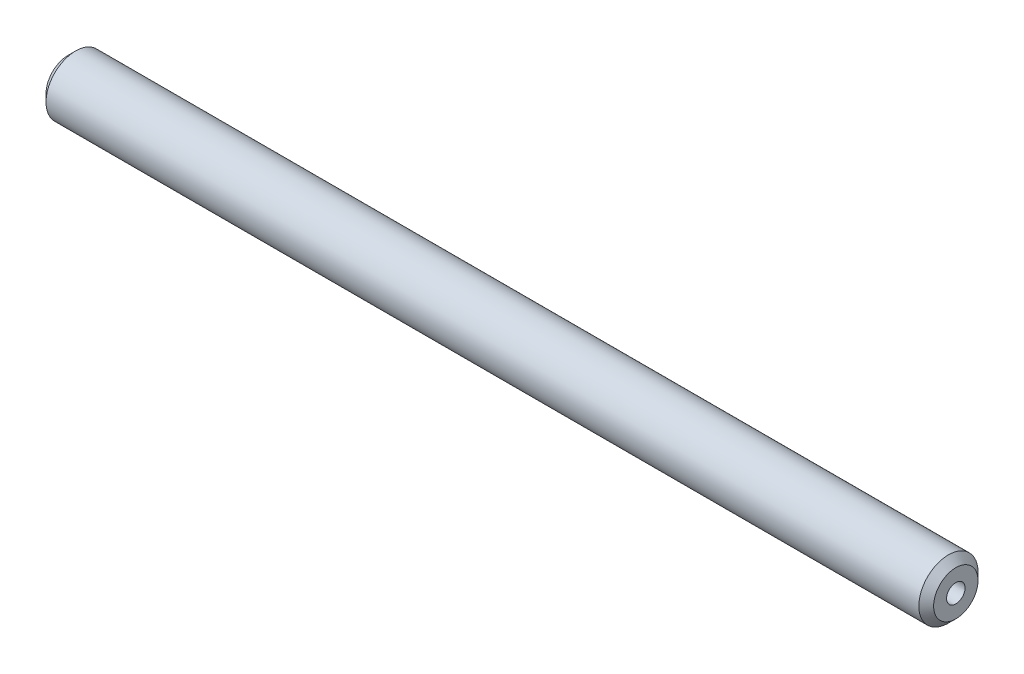
ISO-10303-21;
HEADER;
FILE_DESCRIPTION(('STEP AP214'),'2;1');
FILE_NAME('part.step','',(''),(''),'','','');
FILE_SCHEMA(('AUTOMOTIVE_DESIGN { 1 0 10303 214 1 1 1 1 }'));
ENDSEC;
DATA;
#1=APPLICATION_CONTEXT('core data for automotive mechanical design processes');
#2=APPLICATION_PROTOCOL_DEFINITION('international standard','automotive_design',2000,#1);
#3=PRODUCT_CONTEXT('',#1,'mechanical');
#4=PRODUCT('Part','Part','',(#3));
#5=PRODUCT_RELATED_PRODUCT_CATEGORY('part','',(#4));
#6=PRODUCT_DEFINITION_FORMATION('','',#4);
#7=PRODUCT_DEFINITION_CONTEXT('part definition',#1,'design');
#8=PRODUCT_DEFINITION('design','',#6,#7);
#9=PRODUCT_DEFINITION_SHAPE('','',#8);
#10=(LENGTH_UNIT() NAMED_UNIT(*) SI_UNIT(.MILLI.,.METRE.));
#11=(NAMED_UNIT(*) PLANE_ANGLE_UNIT() SI_UNIT($,.RADIAN.));
#12=(NAMED_UNIT(*) SI_UNIT($,.STERADIAN.) SOLID_ANGLE_UNIT());
#13=UNCERTAINTY_MEASURE_WITH_UNIT(LENGTH_MEASURE(1.E-05),#10,'distance_accuracy_value','');
#14=(GEOMETRIC_REPRESENTATION_CONTEXT(3) GLOBAL_UNCERTAINTY_ASSIGNED_CONTEXT((#13)) GLOBAL_UNIT_ASSIGNED_CONTEXT((#10,
#11,#12)) REPRESENTATION_CONTEXT('',''));
#15=CARTESIAN_POINT('',(0.,0.,0.));
#16=DIRECTION('',(0.,0.,1.));
#17=DIRECTION('',(1.,0.,0.));
#18=AXIS2_PLACEMENT_3D('',#15,#16,#17);
#19=CARTESIAN_POINT('',(60.,0.,0.));
#20=DIRECTION('',(-1.,0.,0.));
#21=DIRECTION('',(0.,0.,1.));
#22=AXIS2_PLACEMENT_3D('',#19,#20,#21);
#23=CYLINDRICAL_SURFACE('',#22,4.);
#24=CARTESIAN_POINT('',(59.,0.,0.));
#25=DIRECTION('',(1.,0.,0.));
#26=DIRECTION('',(0.,0.,-1.));
#27=AXIS2_PLACEMENT_3D('',#24,#25,#26);
#28=CIRCLE('',#27,4.);
#29=CARTESIAN_POINT('',(59.,0.,-4.));
#30=VERTEX_POINT('',#29);
#31=EDGE_CURVE('E50',#30,#30,#28,.F.);
#32=ORIENTED_EDGE('',*,*,#31,.T.);
#33=EDGE_LOOP('',(#32));
#34=FACE_BOUND('',#33,.T.);
#35=CARTESIAN_POINT('',(-59.,0.,0.));
#36=DIRECTION('',(1.,0.,0.));
#37=DIRECTION('',(0.,0.,-1.));
#38=AXIS2_PLACEMENT_3D('',#35,#36,#37);
#39=CIRCLE('',#38,4.);
#40=CARTESIAN_POINT('',(-59.,0.,-4.));
#41=VERTEX_POINT('',#40);
#42=EDGE_CURVE('E80',#41,#41,#39,.T.);
#43=ORIENTED_EDGE('',*,*,#42,.T.);
#44=EDGE_LOOP('',(#43));
#45=FACE_BOUND('',#44,.T.);
#46=ADVANCED_FACE('F42',(#34,#45),#23,.T.);
#47=CARTESIAN_POINT('',(60.,0.,0.));
#48=DIRECTION('',(1.,0.,0.));
#49=DIRECTION('',(0.,0.,-1.));
#50=AXIS2_PLACEMENT_3D('',#47,#48,#49);
#51=PLANE('',#50);
#52=CARTESIAN_POINT('',(60.,0.,0.));
#53=DIRECTION('',(1.,0.,0.));
#54=DIRECTION('',(0.,0.,-1.));
#55=AXIS2_PLACEMENT_3D('',#52,#53,#54);
#56=CIRCLE('',#55,1.25);
#57=CARTESIAN_POINT('',(60.,0.,-1.25));
#58=VERTEX_POINT('',#57);
#59=EDGE_CURVE('E66',#58,#58,#56,.T.);
#60=ORIENTED_EDGE('',*,*,#59,.F.);
#61=EDGE_LOOP('',(#60));
#62=FACE_BOUND('',#61,.T.);
#63=CARTESIAN_POINT('',(60.,0.,0.));
#64=DIRECTION('',(1.,0.,0.));
#65=DIRECTION('',(0.,0.,-1.));
#66=AXIS2_PLACEMENT_3D('',#63,#64,#65);
#67=CIRCLE('',#66,3.00000000000002);
#68=CARTESIAN_POINT('',(60.,0.,-3.00000000000002));
#69=VERTEX_POINT('',#68);
#70=EDGE_CURVE('E77',#69,#69,#67,.T.);
#71=ORIENTED_EDGE('',*,*,#70,.T.);
#72=EDGE_LOOP('',(#71));
#73=FACE_BOUND('',#72,.T.);
#74=ADVANCED_FACE('F93',(#62,#73),#51,.T.);
#75=CARTESIAN_POINT('',(-60.,0.,0.));
#76=DIRECTION('',(1.,0.,0.));
#77=DIRECTION('',(0.,0.,-1.));
#78=AXIS2_PLACEMENT_3D('',#75,#76,#77);
#79=PLANE('',#78);
#80=CARTESIAN_POINT('',(-60.,0.,0.));
#81=DIRECTION('',(-1.,0.,0.));
#82=DIRECTION('',(0.,0.,1.));
#83=AXIS2_PLACEMENT_3D('',#80,#81,#82);
#84=CIRCLE('',#83,1.24999999999999);
#85=CARTESIAN_POINT('',(-60.,0.,1.24999999999999));
#86=VERTEX_POINT('',#85);
#87=EDGE_CURVE('E67',#86,#86,#84,.T.);
#88=ORIENTED_EDGE('',*,*,#87,.F.);
#89=EDGE_LOOP('',(#88));
#90=FACE_BOUND('',#89,.T.);
#91=CARTESIAN_POINT('',(-60.,0.,0.));
#92=DIRECTION('',(1.,0.,0.));
#93=DIRECTION('',(0.,0.,-1.));
#94=AXIS2_PLACEMENT_3D('',#91,#92,#93);
#95=CIRCLE('',#94,3.00000000000002);
#96=CARTESIAN_POINT('',(-60.,0.,-3.00000000000002));
#97=VERTEX_POINT('',#96);
#98=EDGE_CURVE('E11',#97,#97,#95,.F.);
#99=ORIENTED_EDGE('',*,*,#98,.T.);
#100=EDGE_LOOP('',(#99));
#101=FACE_BOUND('',#100,.T.);
#102=ADVANCED_FACE('F90',(#90,#101),#79,.F.);
#103=CARTESIAN_POINT('',(60.,0.,0.));
#104=DIRECTION('',(-1.,0.,0.));
#105=DIRECTION('',(0.,0.,1.));
#106=AXIS2_PLACEMENT_3D('',#103,#104,#105);
#107=CONICAL_SURFACE('',#106,3.00000000000002,0.785398163397447);
#108=ORIENTED_EDGE('',*,*,#31,.F.);
#109=EDGE_LOOP('',(#108));
#110=FACE_BOUND('',#109,.T.);
#111=ORIENTED_EDGE('',*,*,#70,.F.);
#112=EDGE_LOOP('',(#111));
#113=FACE_BOUND('',#112,.T.);
#114=ADVANCED_FACE('F87',(#110,#113),#107,.T.);
#115=CARTESIAN_POINT('',(-59.,0.,0.));
#116=DIRECTION('',(1.,0.,0.));
#117=DIRECTION('',(0.,0.,-1.));
#118=AXIS2_PLACEMENT_3D('',#115,#116,#117);
#119=CONICAL_SURFACE('',#118,4.,0.785398163397447);
#120=ORIENTED_EDGE('',*,*,#98,.F.);
#121=EDGE_LOOP('',(#120));
#122=FACE_BOUND('',#121,.T.);
#123=ORIENTED_EDGE('',*,*,#42,.F.);
#124=EDGE_LOOP('',(#123));
#125=FACE_BOUND('',#124,.T.);
#126=ADVANCED_FACE('F44',(#122,#125),#119,.T.);
#127=CARTESIAN_POINT('',(51.5,0.,0.));
#128=DIRECTION('',(1.,0.,0.));
#129=DIRECTION('',(0.,0.,-1.));
#130=AXIS2_PLACEMENT_3D('',#127,#128,#129);
#131=CONICAL_SURFACE('',#130,1.25,1.02974425867665);
#132=CARTESIAN_POINT('',(50.7489242262155,0.,0.));
#133=VERTEX_POINT('',#132);
#134=VERTEX_LOOP('',#133);
#135=FACE_BOUND('',#134,.T.);
#136=CARTESIAN_POINT('',(51.5,0.,0.));
#137=DIRECTION('',(1.,0.,0.));
#138=DIRECTION('',(0.,0.,-1.));
#139=AXIS2_PLACEMENT_3D('',#136,#137,#138);
#140=CIRCLE('',#139,1.25);
#141=CARTESIAN_POINT('',(51.5,0.,-1.25));
#142=VERTEX_POINT('',#141);
#143=EDGE_CURVE('E70',#142,#142,#140,.T.);
#144=ORIENTED_EDGE('',*,*,#143,.T.);
#145=EDGE_LOOP('',(#144));
#146=FACE_BOUND('',#145,.T.);
#147=ADVANCED_FACE('F106',(#135,#146),#131,.F.);
#148=CARTESIAN_POINT('',(60.,0.,0.));
#149=DIRECTION('',(1.,0.,0.));
#150=DIRECTION('',(0.,0.,-1.));
#151=AXIS2_PLACEMENT_3D('',#148,#149,#150);
#152=CYLINDRICAL_SURFACE('',#151,1.25);
#153=ORIENTED_EDGE('',*,*,#143,.F.);
#154=EDGE_LOOP('',(#153));
#155=FACE_BOUND('',#154,.T.);
#156=ORIENTED_EDGE('',*,*,#59,.T.);
#157=EDGE_LOOP('',(#156));
#158=FACE_BOUND('',#157,.T.);
#159=ADVANCED_FACE('F60',(#155,#158),#152,.F.);
#160=CARTESIAN_POINT('',(-51.5,0.,0.));
#161=DIRECTION('',(-1.,0.,0.));
#162=DIRECTION('',(0.,0.,1.));
#163=AXIS2_PLACEMENT_3D('',#160,#161,#162);
#164=CONICAL_SURFACE('',#163,1.24999999999999,1.02974425867665);
#165=CARTESIAN_POINT('',(-50.7489242262156,0.,0.));
#166=VERTEX_POINT('',#165);
#167=VERTEX_LOOP('',#166);
#168=FACE_BOUND('',#167,.T.);
#169=CARTESIAN_POINT('',(-51.5,0.,0.));
#170=DIRECTION('',(-1.,0.,0.));
#171=DIRECTION('',(0.,0.,1.));
#172=AXIS2_PLACEMENT_3D('',#169,#170,#171);
#173=CIRCLE('',#172,1.24999999999999);
#174=CARTESIAN_POINT('',(-51.5,0.,1.24999999999999));
#175=VERTEX_POINT('',#174);
#176=EDGE_CURVE('E64',#175,#175,#173,.T.);
#177=ORIENTED_EDGE('',*,*,#176,.T.);
#178=EDGE_LOOP('',(#177));
#179=FACE_BOUND('',#178,.T.);
#180=ADVANCED_FACE('F56',(#168,#179),#164,.F.);
#181=CARTESIAN_POINT('',(-60.,0.,0.));
#182=DIRECTION('',(-1.,0.,0.));
#183=DIRECTION('',(0.,0.,1.));
#184=AXIS2_PLACEMENT_3D('',#181,#182,#183);
#185=CYLINDRICAL_SURFACE('',#184,1.24999999999999);
#186=ORIENTED_EDGE('',*,*,#176,.F.);
#187=EDGE_LOOP('',(#186));
#188=FACE_BOUND('',#187,.T.);
#189=ORIENTED_EDGE('',*,*,#87,.T.);
#190=EDGE_LOOP('',(#189));
#191=FACE_BOUND('',#190,.T.);
#192=ADVANCED_FACE('F59',(#188,#191),#185,.F.);
#193=CLOSED_SHELL('',(#46,#74,#102,#114,#126,#147,#159,#180,#192));
#194=MANIFOLD_SOLID_BREP('B2',#193);
#195=ADVANCED_BREP_SHAPE_REPRESENTATION('',(#18,#194),#14);
#196=SHAPE_DEFINITION_REPRESENTATION(#9,#195);
ENDSEC;
END-ISO-10303-21;
